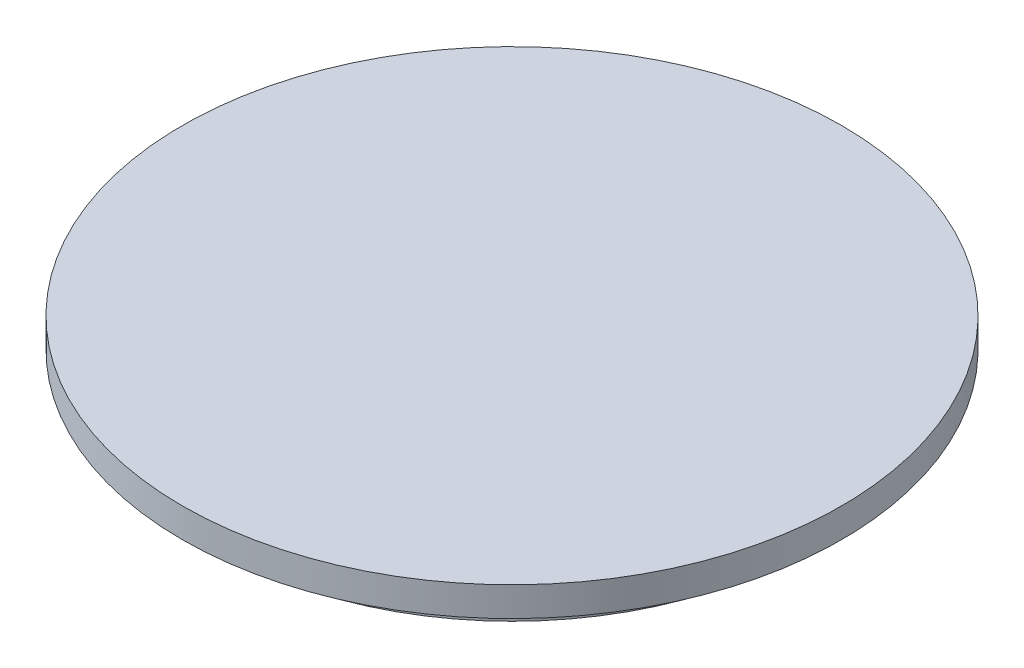
ISO-10303-21;
HEADER;
FILE_DESCRIPTION(('STEP AP214'),'2;1');
FILE_NAME('part.step','',(''),(''),'','','');
FILE_SCHEMA(('AUTOMOTIVE_DESIGN { 1 0 10303 214 1 1 1 1 }'));
ENDSEC;
DATA;
#1=APPLICATION_CONTEXT('core data for automotive mechanical design processes');
#2=APPLICATION_PROTOCOL_DEFINITION('international standard','automotive_design',2000,#1);
#3=PRODUCT_CONTEXT('',#1,'mechanical');
#4=PRODUCT('Part','Part','',(#3));
#5=PRODUCT_RELATED_PRODUCT_CATEGORY('part','',(#4));
#6=PRODUCT_DEFINITION_FORMATION('','',#4);
#7=PRODUCT_DEFINITION_CONTEXT('part definition',#1,'design');
#8=PRODUCT_DEFINITION('design','',#6,#7);
#9=PRODUCT_DEFINITION_SHAPE('','',#8);
#10=(LENGTH_UNIT() NAMED_UNIT(*) SI_UNIT(.MILLI.,.METRE.));
#11=(NAMED_UNIT(*) PLANE_ANGLE_UNIT() SI_UNIT($,.RADIAN.));
#12=(NAMED_UNIT(*) SI_UNIT($,.STERADIAN.) SOLID_ANGLE_UNIT());
#13=UNCERTAINTY_MEASURE_WITH_UNIT(LENGTH_MEASURE(1.E-05),#10,'distance_accuracy_value','');
#14=(GEOMETRIC_REPRESENTATION_CONTEXT(3) GLOBAL_UNCERTAINTY_ASSIGNED_CONTEXT((#13)) GLOBAL_UNIT_ASSIGNED_CONTEXT((#10,
#11,#12)) REPRESENTATION_CONTEXT('',''));
#15=CARTESIAN_POINT('',(0.,0.,0.));
#16=DIRECTION('',(0.,0.,1.));
#17=DIRECTION('',(1.,0.,0.));
#18=AXIS2_PLACEMENT_3D('',#15,#16,#17);
#19=CARTESIAN_POINT('',(0.,2.,0.));
#20=DIRECTION('',(0.,-1.,0.));
#21=DIRECTION('',(0.,0.,-1.));
#22=AXIS2_PLACEMENT_3D('',#19,#20,#21);
#23=CYLINDRICAL_SURFACE('',#22,22.5);
#24=CARTESIAN_POINT('',(0.,2.,0.));
#25=DIRECTION('',(0.,1.,0.));
#26=DIRECTION('',(0.,0.,1.));
#27=AXIS2_PLACEMENT_3D('',#24,#25,#26);
#28=CIRCLE('',#27,22.5);
#29=CARTESIAN_POINT('',(0.,2.,22.5));
#30=VERTEX_POINT('',#29);
#31=EDGE_CURVE('E46',#30,#30,#28,.T.);
#32=ORIENTED_EDGE('',*,*,#31,.F.);
#33=EDGE_LOOP('',(#32));
#34=FACE_BOUND('',#33,.T.);
#35=CARTESIAN_POINT('',(0.,0.,0.));
#36=DIRECTION('',(0.,1.,0.));
#37=DIRECTION('',(0.,0.,1.));
#38=AXIS2_PLACEMENT_3D('',#35,#36,#37);
#39=CIRCLE('',#38,22.5);
#40=CARTESIAN_POINT('',(0.,0.,22.5));
#41=VERTEX_POINT('',#40);
#42=EDGE_CURVE('E51',#41,#41,#39,.T.);
#43=ORIENTED_EDGE('',*,*,#42,.T.);
#44=EDGE_LOOP('',(#43));
#45=FACE_BOUND('',#44,.T.);
#46=ADVANCED_FACE('F39',(#34,#45),#23,.T.);
#47=CARTESIAN_POINT('',(0.,2.,0.));
#48=DIRECTION('',(0.,1.,0.));
#49=DIRECTION('',(0.,0.,1.));
#50=AXIS2_PLACEMENT_3D('',#47,#48,#49);
#51=PLANE('',#50);
#52=ORIENTED_EDGE('',*,*,#31,.T.);
#53=EDGE_LOOP('',(#52));
#54=FACE_BOUND('',#53,.T.);
#55=ADVANCED_FACE('F87',(#54),#51,.T.);
#56=CARTESIAN_POINT('',(0.,0.,0.));
#57=DIRECTION('',(0.,1.,0.));
#58=DIRECTION('',(0.,0.,1.));
#59=AXIS2_PLACEMENT_3D('',#56,#57,#58);
#60=PLANE('',#59);
#61=CARTESIAN_POINT('',(0.,0.,0.));
#62=DIRECTION('',(0.,1.,0.));
#63=DIRECTION('',(0.,0.,1.));
#64=AXIS2_PLACEMENT_3D('',#61,#62,#63);
#65=CIRCLE('',#64,19.9);
#66=CARTESIAN_POINT('',(0.,0.,19.9));
#67=VERTEX_POINT('',#66);
#68=EDGE_CURVE('E59',#67,#67,#65,.T.);
#69=ORIENTED_EDGE('',*,*,#68,.T.);
#70=EDGE_LOOP('',(#69));
#71=FACE_BOUND('',#70,.T.);
#72=ORIENTED_EDGE('',*,*,#42,.F.);
#73=EDGE_LOOP('',(#72));
#74=FACE_BOUND('',#73,.T.);
#75=ADVANCED_FACE('F83',(#71,#74),#60,.F.);
#76=CARTESIAN_POINT('',(0.,-2.,0.));
#77=DIRECTION('',(0.,1.,0.));
#78=DIRECTION('',(0.,0.,1.));
#79=AXIS2_PLACEMENT_3D('',#76,#77,#78);
#80=CYLINDRICAL_SURFACE('',#79,19.9);
#81=CARTESIAN_POINT('',(0.,-2.,0.));
#82=DIRECTION('',(0.,1.,0.));
#83=DIRECTION('',(0.,0.,1.));
#84=AXIS2_PLACEMENT_3D('',#81,#82,#83);
#85=CIRCLE('',#84,19.9);
#86=CARTESIAN_POINT('',(0.,-2.,19.9));
#87=VERTEX_POINT('',#86);
#88=EDGE_CURVE('E57',#87,#87,#85,.T.);
#89=ORIENTED_EDGE('',*,*,#88,.T.);
#90=EDGE_LOOP('',(#89));
#91=FACE_BOUND('',#90,.T.);
#92=ORIENTED_EDGE('',*,*,#68,.F.);
#93=EDGE_LOOP('',(#92));
#94=FACE_BOUND('',#93,.T.);
#95=ADVANCED_FACE('F84',(#91,#94),#80,.T.);
#96=CARTESIAN_POINT('',(0.,-2.,0.));
#97=DIRECTION('',(0.,1.,0.));
#98=DIRECTION('',(0.,0.,1.));
#99=AXIS2_PLACEMENT_3D('',#96,#97,#98);
#100=PLANE('',#99);
#101=CARTESIAN_POINT('',(0.,-2.,0.));
#102=DIRECTION('',(0.,1.,0.));
#103=DIRECTION('',(0.,0.,1.));
#104=AXIS2_PLACEMENT_3D('',#101,#102,#103);
#105=CIRCLE('',#104,17.9);
#106=CARTESIAN_POINT('',(0.,-2.,17.9));
#107=VERTEX_POINT('',#106);
#108=EDGE_CURVE('E63',#107,#107,#105,.T.);
#109=ORIENTED_EDGE('',*,*,#108,.T.);
#110=EDGE_LOOP('',(#109));
#111=FACE_BOUND('',#110,.T.);
#112=ORIENTED_EDGE('',*,*,#88,.F.);
#113=EDGE_LOOP('',(#112));
#114=FACE_BOUND('',#113,.T.);
#115=ADVANCED_FACE('F71',(#111,#114),#100,.F.);
#116=CARTESIAN_POINT('',(0.,-2.,0.));
#117=DIRECTION('',(0.,1.,0.));
#118=DIRECTION('',(0.,0.,1.));
#119=AXIS2_PLACEMENT_3D('',#116,#117,#118);
#120=CYLINDRICAL_SURFACE('',#119,17.9);
#121=ORIENTED_EDGE('',*,*,#108,.F.);
#122=EDGE_LOOP('',(#121));
#123=FACE_BOUND('',#122,.T.);
#124=CARTESIAN_POINT('',(0.,0.,0.));
#125=DIRECTION('',(0.,1.,0.));
#126=DIRECTION('',(0.,0.,1.));
#127=AXIS2_PLACEMENT_3D('',#124,#125,#126);
#128=CIRCLE('',#127,17.9);
#129=CARTESIAN_POINT('',(0.,0.,17.9));
#130=VERTEX_POINT('',#129);
#131=EDGE_CURVE('E10',#130,#130,#128,.T.);
#132=ORIENTED_EDGE('',*,*,#131,.T.);
#133=EDGE_LOOP('',(#132));
#134=FACE_BOUND('',#133,.T.);
#135=ADVANCED_FACE('F74',(#123,#134),#120,.F.);
#136=ORIENTED_EDGE('',*,*,#131,.F.);
#137=EDGE_LOOP('',(#136));
#138=FACE_BOUND('',#137,.T.);
#139=ADVANCED_FACE('F76',(#138),#60,.F.);
#140=CLOSED_SHELL('',(#46,#55,#75,#95,#115,#135,#139));
#141=MANIFOLD_SOLID_BREP('B2',#140);
#142=ADVANCED_BREP_SHAPE_REPRESENTATION('',(#18,#141),#14);
#143=SHAPE_DEFINITION_REPRESENTATION(#9,#142);
ENDSEC;
END-ISO-10303-21;
